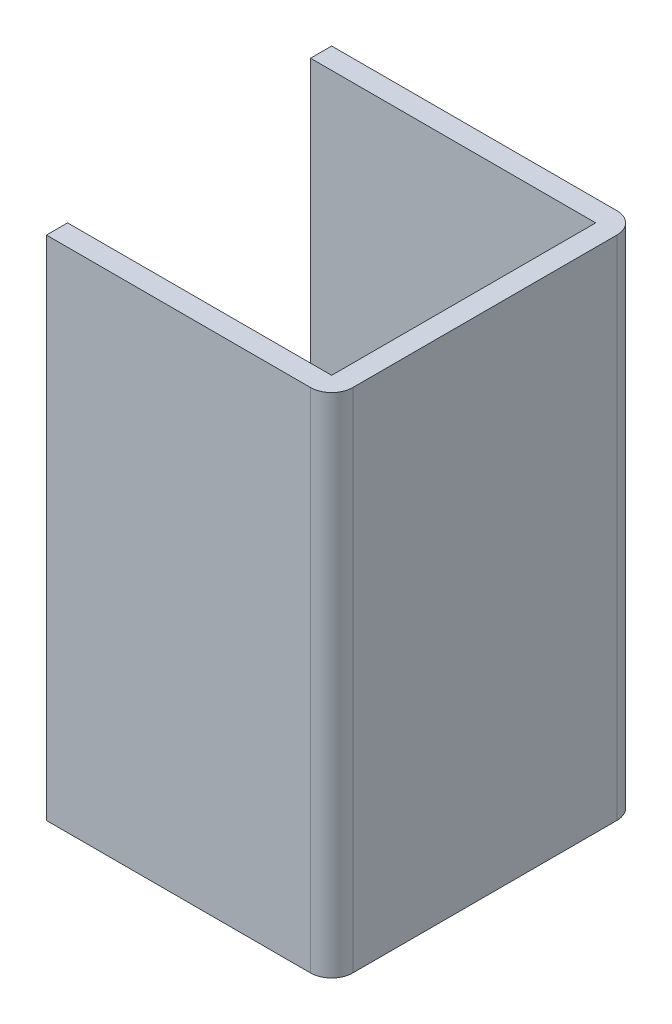
ISO-10303-21;
HEADER;
FILE_DESCRIPTION(('STEP AP214'),'2;1');
FILE_NAME('part.step','',(''),(''),'','','');
FILE_SCHEMA(('AUTOMOTIVE_DESIGN { 1 0 10303 214 1 1 1 1 }'));
ENDSEC;
DATA;
#1=APPLICATION_CONTEXT('core data for automotive mechanical design processes');
#2=APPLICATION_PROTOCOL_DEFINITION('international standard','automotive_design',2000,#1);
#3=PRODUCT_CONTEXT('',#1,'mechanical');
#4=PRODUCT('Part','Part','',(#3));
#5=PRODUCT_RELATED_PRODUCT_CATEGORY('part','',(#4));
#6=PRODUCT_DEFINITION_FORMATION('','',#4);
#7=PRODUCT_DEFINITION_CONTEXT('part definition',#1,'design');
#8=PRODUCT_DEFINITION('design','',#6,#7);
#9=PRODUCT_DEFINITION_SHAPE('','',#8);
#10=(LENGTH_UNIT() NAMED_UNIT(*) SI_UNIT(.MILLI.,.METRE.));
#11=(NAMED_UNIT(*) PLANE_ANGLE_UNIT() SI_UNIT($,.RADIAN.));
#12=(NAMED_UNIT(*) SI_UNIT($,.STERADIAN.) SOLID_ANGLE_UNIT());
#13=UNCERTAINTY_MEASURE_WITH_UNIT(LENGTH_MEASURE(1.E-05),#10,'distance_accuracy_value','');
#14=(GEOMETRIC_REPRESENTATION_CONTEXT(3) GLOBAL_UNCERTAINTY_ASSIGNED_CONTEXT((#13)) GLOBAL_UNIT_ASSIGNED_CONTEXT((#10,
#11,#12)) REPRESENTATION_CONTEXT('',''));
#15=CARTESIAN_POINT('',(0.,0.,0.));
#16=DIRECTION('',(0.,0.,1.));
#17=DIRECTION('',(1.,0.,0.));
#18=AXIS2_PLACEMENT_3D('',#15,#16,#17);
#19=CARTESIAN_POINT('',(2.3,-1.2,1.35));
#20=DIRECTION('',(1.,0.,0.));
#21=DIRECTION('',(0.,0.,-1.));
#22=AXIS2_PLACEMENT_3D('',#19,#20,#21);
#23=PLANE('',#22);
#24=DIRECTION('',(0.,0.,-1.));
#25=VECTOR('',#24,1.);
#26=CARTESIAN_POINT('',(2.3,1.2,1.35));
#27=LINE('',#26,#25);
#28=CARTESIAN_POINT('',(2.3,1.2,1.35));
#29=VERTEX_POINT('',#28);
#30=CARTESIAN_POINT('',(2.3,1.2,1.45));
#31=VERTEX_POINT('',#30);
#32=EDGE_CURVE('E117',#29,#31,#27,.F.);
#33=ORIENTED_EDGE('',*,*,#32,.F.);
#34=DIRECTION('',(0.,1.,0.));
#35=VECTOR('',#34,1.);
#36=CARTESIAN_POINT('',(2.3,-1.2,1.35));
#37=LINE('',#36,#35);
#38=CARTESIAN_POINT('',(2.3,-1.2,1.35));
#39=VERTEX_POINT('',#38);
#40=EDGE_CURVE('E115',#29,#39,#37,.F.);
#41=ORIENTED_EDGE('',*,*,#40,.T.);
#42=DIRECTION('',(0.,0.,-1.));
#43=VECTOR('',#42,1.);
#44=CARTESIAN_POINT('',(2.3,-1.2,1.35));
#45=LINE('',#44,#43);
#46=CARTESIAN_POINT('',(2.3,-1.2,1.45));
#47=VERTEX_POINT('',#46);
#48=EDGE_CURVE('E96',#47,#39,#45,.T.);
#49=ORIENTED_EDGE('',*,*,#48,.F.);
#50=DIRECTION('',(0.,1.,0.));
#51=VECTOR('',#50,1.);
#52=CARTESIAN_POINT('',(2.3,0.,1.45));
#53=LINE('',#52,#51);
#54=EDGE_CURVE('E112',#31,#47,#53,.F.);
#55=ORIENTED_EDGE('',*,*,#54,.F.);
#56=EDGE_LOOP('',(#33,#41,#49,#55));
#57=FACE_BOUND('',#56,.T.);
#58=ADVANCED_FACE('F17',(#57),#23,.F.);
#59=CARTESIAN_POINT('',(2.3,-1.2,1.35));
#60=DIRECTION('',(0.,0.,1.));
#61=DIRECTION('',(1.,0.,0.));
#62=AXIS2_PLACEMENT_3D('',#59,#60,#61);
#63=PLANE('',#62);
#64=DIRECTION('',(0.,1.,0.));
#65=VECTOR('',#64,1.);
#66=CARTESIAN_POINT('',(3.55,-1.2,1.35));
#67=LINE('',#66,#65);
#68=CARTESIAN_POINT('',(3.55,1.2,1.35));
#69=VERTEX_POINT('',#68);
#70=CARTESIAN_POINT('',(3.55,-1.2,1.35));
#71=VERTEX_POINT('',#70);
#72=EDGE_CURVE('E153',#69,#71,#67,.F.);
#73=ORIENTED_EDGE('',*,*,#72,.T.);
#74=DIRECTION('',(1.,0.,0.));
#75=VECTOR('',#74,1.);
#76=CARTESIAN_POINT('',(2.3,-1.2,1.35));
#77=LINE('',#76,#75);
#78=EDGE_CURVE('E137',#39,#71,#77,.T.);
#79=ORIENTED_EDGE('',*,*,#78,.F.);
#80=ORIENTED_EDGE('',*,*,#40,.F.);
#81=DIRECTION('',(1.,0.,0.));
#82=VECTOR('',#81,1.);
#83=CARTESIAN_POINT('',(2.3,1.2,1.35));
#84=LINE('',#83,#82);
#85=EDGE_CURVE('E108',#69,#29,#84,.F.);
#86=ORIENTED_EDGE('',*,*,#85,.F.);
#87=EDGE_LOOP('',(#73,#79,#80,#86));
#88=FACE_BOUND('',#87,.T.);
#89=ADVANCED_FACE('F174',(#88),#63,.F.);
#90=CARTESIAN_POINT('',(2.975,0.,1.45));
#91=DIRECTION('',(0.,0.,1.));
#92=DIRECTION('',(1.,0.,0.));
#93=AXIS2_PLACEMENT_3D('',#90,#91,#92);
#94=PLANE('',#93);
#95=DIRECTION('',(1.,0.,0.));
#96=VECTOR('',#95,1.);
#97=CARTESIAN_POINT('',(2.975,1.2,1.45));
#98=LINE('',#97,#96);
#99=CARTESIAN_POINT('',(3.55,1.2,1.45));
#100=VERTEX_POINT('',#99);
#101=EDGE_CURVE('E107',#100,#31,#98,.F.);
#102=ORIENTED_EDGE('',*,*,#101,.T.);
#103=ORIENTED_EDGE('',*,*,#54,.T.);
#104=DIRECTION('',(1.,0.,0.));
#105=VECTOR('',#104,1.);
#106=CARTESIAN_POINT('',(2.975,-1.2,1.45));
#107=LINE('',#106,#105);
#108=CARTESIAN_POINT('',(3.55,-1.2,1.45));
#109=VERTEX_POINT('',#108);
#110=EDGE_CURVE('E99',#47,#109,#107,.T.);
#111=ORIENTED_EDGE('',*,*,#110,.T.);
#112=DIRECTION('',(0.,1.,0.));
#113=VECTOR('',#112,1.);
#114=CARTESIAN_POINT('',(3.55,-1.2,1.45));
#115=LINE('',#114,#113);
#116=EDGE_CURVE('E146',#100,#109,#115,.F.);
#117=ORIENTED_EDGE('',*,*,#116,.F.);
#118=EDGE_LOOP('',(#102,#103,#111,#117));
#119=FACE_BOUND('',#118,.T.);
#120=ADVANCED_FACE('F119',(#119),#94,.T.);
#121=CARTESIAN_POINT('',(3.55,-1.2,0.));
#122=DIRECTION('',(1.,0.,0.));
#123=DIRECTION('',(0.,0.,-1.));
#124=AXIS2_PLACEMENT_3D('',#121,#122,#123);
#125=PLANE('',#124);
#126=DIRECTION('',(0.,0.,-1.));
#127=VECTOR('',#126,1.);
#128=CARTESIAN_POINT('',(3.55,1.2,0.));
#129=LINE('',#128,#127);
#130=CARTESIAN_POINT('',(3.55,1.2,0.1));
#131=VERTEX_POINT('',#130);
#132=EDGE_CURVE('E122',#131,#69,#129,.F.);
#133=ORIENTED_EDGE('',*,*,#132,.F.);
#134=DIRECTION('',(0.,1.,0.));
#135=VECTOR('',#134,1.);
#136=CARTESIAN_POINT('',(3.55,-1.2,0.1));
#137=LINE('',#136,#135);
#138=CARTESIAN_POINT('',(3.55,-1.2,0.1));
#139=VERTEX_POINT('',#138);
#140=EDGE_CURVE('E145',#139,#131,#137,.T.);
#141=ORIENTED_EDGE('',*,*,#140,.F.);
#142=DIRECTION('',(0.,0.,-1.));
#143=VECTOR('',#142,1.);
#144=CARTESIAN_POINT('',(3.55,-1.2,0.));
#145=LINE('',#144,#143);
#146=EDGE_CURVE('E120',#71,#139,#145,.T.);
#147=ORIENTED_EDGE('',*,*,#146,.F.);
#148=ORIENTED_EDGE('',*,*,#72,.F.);
#149=EDGE_LOOP('',(#133,#141,#147,#148));
#150=FACE_BOUND('',#149,.T.);
#151=ADVANCED_FACE('F176',(#150),#125,.F.);
#152=CARTESIAN_POINT('',(3.55,-1.2,1.35));
#153=DIRECTION('',(0.,1.,0.));
#154=DIRECTION('',(0.,0.,1.));
#155=AXIS2_PLACEMENT_3D('',#152,#153,#154);
#156=CYLINDRICAL_SURFACE('',#155,0.1);
#157=ORIENTED_EDGE('',*,*,#116,.T.);
#158=CARTESIAN_POINT('',(3.55,-1.2,1.35));
#159=DIRECTION('',(0.,1.,0.));
#160=DIRECTION('',(0.,0.,1.));
#161=AXIS2_PLACEMENT_3D('',#158,#159,#160);
#162=CIRCLE('',#161,0.1);
#163=CARTESIAN_POINT('',(3.65,-1.2,1.35));
#164=VERTEX_POINT('',#163);
#165=EDGE_CURVE('E102',#109,#164,#162,.T.);
#166=ORIENTED_EDGE('',*,*,#165,.T.);
#167=DIRECTION('',(0.,1.,0.));
#168=VECTOR('',#167,1.);
#169=CARTESIAN_POINT('',(3.65,-1.2,1.35));
#170=LINE('',#169,#168);
#171=CARTESIAN_POINT('',(3.65,1.2,1.35));
#172=VERTEX_POINT('',#171);
#173=EDGE_CURVE('E187',#172,#164,#170,.F.);
#174=ORIENTED_EDGE('',*,*,#173,.F.);
#175=CARTESIAN_POINT('',(3.55,1.2,1.35));
#176=DIRECTION('',(0.,1.,0.));
#177=DIRECTION('',(0.,0.,1.));
#178=AXIS2_PLACEMENT_3D('',#175,#176,#177);
#179=CIRCLE('',#178,0.1);
#180=EDGE_CURVE('E20',#172,#100,#179,.F.);
#181=ORIENTED_EDGE('',*,*,#180,.T.);
#182=EDGE_LOOP('',(#157,#166,#174,#181));
#183=FACE_BOUND('',#182,.T.);
#184=ADVANCED_FACE('F292',(#183),#156,.T.);
#185=CARTESIAN_POINT('',(2.2,-1.2,0.1));
#186=DIRECTION('',(0.,0.,1.));
#187=DIRECTION('',(1.,0.,0.));
#188=AXIS2_PLACEMENT_3D('',#185,#186,#187);
#189=PLANE('',#188);
#190=ORIENTED_EDGE('',*,*,#140,.T.);
#191=DIRECTION('',(1.,0.,0.));
#192=VECTOR('',#191,1.);
#193=CARTESIAN_POINT('',(2.2,1.2,0.1));
#194=LINE('',#193,#192);
#195=CARTESIAN_POINT('',(2.2,1.2,0.1));
#196=VERTEX_POINT('',#195);
#197=EDGE_CURVE('E150',#131,#196,#194,.F.);
#198=ORIENTED_EDGE('',*,*,#197,.T.);
#199=DIRECTION('',(0.,1.,0.));
#200=VECTOR('',#199,1.);
#201=CARTESIAN_POINT('',(2.2,-1.2,0.1));
#202=LINE('',#201,#200);
#203=CARTESIAN_POINT('',(2.2,-1.2,0.1));
#204=VERTEX_POINT('',#203);
#205=EDGE_CURVE('E181',#196,#204,#202,.F.);
#206=ORIENTED_EDGE('',*,*,#205,.T.);
#207=DIRECTION('',(1.,0.,0.));
#208=VECTOR('',#207,1.);
#209=CARTESIAN_POINT('',(3.129518072289,-1.2,0.1));
#210=LINE('',#209,#208);
#211=EDGE_CURVE('E74',#139,#204,#210,.F.);
#212=ORIENTED_EDGE('',*,*,#211,.F.);
#213=EDGE_LOOP('',(#190,#198,#206,#212));
#214=FACE_BOUND('',#213,.T.);
#215=ADVANCED_FACE('F179',(#214),#189,.T.);
#216=CARTESIAN_POINT('',(3.65,-1.2,0.));
#217=DIRECTION('',(1.,0.,0.));
#218=DIRECTION('',(0.,0.,-1.));
#219=AXIS2_PLACEMENT_3D('',#216,#217,#218);
#220=PLANE('',#219);
#221=DIRECTION('',(0.,0.,1.));
#222=VECTOR('',#221,1.);
#223=CARTESIAN_POINT('',(3.65,1.2,0.708734939759));
#224=LINE('',#223,#222);
#225=CARTESIAN_POINT('',(3.65,1.2,0.1));
#226=VERTEX_POINT('',#225);
#227=EDGE_CURVE('E205',#172,#226,#224,.F.);
#228=ORIENTED_EDGE('',*,*,#227,.F.);
#229=ORIENTED_EDGE('',*,*,#173,.T.);
#230=DIRECTION('',(0.,0.,1.));
#231=VECTOR('',#230,1.);
#232=CARTESIAN_POINT('',(3.65,-1.2,0.708734939759));
#233=LINE('',#232,#231);
#234=CARTESIAN_POINT('',(3.65,-1.2,0.1));
#235=VERTEX_POINT('',#234);
#236=EDGE_CURVE('E184',#235,#164,#233,.T.);
#237=ORIENTED_EDGE('',*,*,#236,.F.);
#238=DIRECTION('',(0.,1.,0.));
#239=VECTOR('',#238,1.);
#240=CARTESIAN_POINT('',(3.65,-1.2,0.1));
#241=LINE('',#240,#239);
#242=EDGE_CURVE('E141',#226,#235,#241,.F.);
#243=ORIENTED_EDGE('',*,*,#242,.F.);
#244=EDGE_LOOP('',(#228,#229,#237,#243));
#245=FACE_BOUND('',#244,.T.);
#246=ADVANCED_FACE('F230',(#245),#220,.T.);
#247=CARTESIAN_POINT('',(3.129518072289,-1.2,0.708734939759));
#248=DIRECTION('',(0.,-1.,0.));
#249=DIRECTION('',(1.,0.,0.));
#250=AXIS2_PLACEMENT_3D('',#247,#248,#249);
#251=PLANE('',#250);
#252=ORIENTED_EDGE('',*,*,#211,.T.);
#253=DIRECTION('',(0.,0.,-1.));
#254=VECTOR('',#253,1.);
#255=CARTESIAN_POINT('',(2.2,-1.2,0.));
#256=LINE('',#255,#254);
#257=CARTESIAN_POINT('',(2.2,-1.2,0.));
#258=VERTEX_POINT('',#257);
#259=EDGE_CURVE('E183',#204,#258,#256,.T.);
#260=ORIENTED_EDGE('',*,*,#259,.T.);
#261=DIRECTION('',(-1.,0.,0.));
#262=VECTOR('',#261,1.);
#263=CARTESIAN_POINT('',(2.925,-1.2,0.));
#264=LINE('',#263,#262);
#265=CARTESIAN_POINT('',(3.55,-1.2,0.));
#266=VERTEX_POINT('',#265);
#267=EDGE_CURVE('E207',#266,#258,#264,.T.);
#268=ORIENTED_EDGE('',*,*,#267,.F.);
#269=CARTESIAN_POINT('',(3.55,-1.2,0.1));
#270=DIRECTION('',(0.,1.,0.));
#271=DIRECTION('',(0.,0.,1.));
#272=AXIS2_PLACEMENT_3D('',#269,#270,#271);
#273=CIRCLE('',#272,0.1);
#274=EDGE_CURVE('E142',#235,#266,#273,.T.);
#275=ORIENTED_EDGE('',*,*,#274,.F.);
#276=ORIENTED_EDGE('',*,*,#236,.T.);
#277=ORIENTED_EDGE('',*,*,#165,.F.);
#278=ORIENTED_EDGE('',*,*,#110,.F.);
#279=ORIENTED_EDGE('',*,*,#48,.T.);
#280=ORIENTED_EDGE('',*,*,#78,.T.);
#281=ORIENTED_EDGE('',*,*,#146,.T.);
#282=EDGE_LOOP('',(#252,#260,#268,#275,#276,#277,#278,#279,#280,#281));
#283=FACE_BOUND('',#282,.T.);
#284=ADVANCED_FACE('F100',(#283),#251,.T.);
#285=CARTESIAN_POINT('',(2.2,-1.2,0.));
#286=DIRECTION('',(1.,0.,0.));
#287=DIRECTION('',(0.,0.,-1.));
#288=AXIS2_PLACEMENT_3D('',#285,#286,#287);
#289=PLANE('',#288);
#290=DIRECTION('',(0.,0.,1.));
#291=VECTOR('',#290,1.);
#292=CARTESIAN_POINT('',(2.2,1.2,0.708734939759));
#293=LINE('',#292,#291);
#294=CARTESIAN_POINT('',(2.2,1.2,0.));
#295=VERTEX_POINT('',#294);
#296=EDGE_CURVE('E144',#295,#196,#293,.T.);
#297=ORIENTED_EDGE('',*,*,#296,.F.);
#298=DIRECTION('',(0.,1.,0.));
#299=VECTOR('',#298,1.);
#300=CARTESIAN_POINT('',(2.2,0.,0.));
#301=LINE('',#300,#299);
#302=EDGE_CURVE('E213',#258,#295,#301,.T.);
#303=ORIENTED_EDGE('',*,*,#302,.F.);
#304=ORIENTED_EDGE('',*,*,#259,.F.);
#305=ORIENTED_EDGE('',*,*,#205,.F.);
#306=EDGE_LOOP('',(#297,#303,#304,#305));
#307=FACE_BOUND('',#306,.T.);
#308=ADVANCED_FACE('F238',(#307),#289,.F.);
#309=CARTESIAN_POINT('',(3.129518072289,1.2,0.708734939759));
#310=DIRECTION('',(0.,1.,0.));
#311=DIRECTION('',(-1.,0.,0.));
#312=AXIS2_PLACEMENT_3D('',#309,#310,#311);
#313=PLANE('',#312);
#314=ORIENTED_EDGE('',*,*,#85,.T.);
#315=ORIENTED_EDGE('',*,*,#32,.T.);
#316=ORIENTED_EDGE('',*,*,#101,.F.);
#317=ORIENTED_EDGE('',*,*,#180,.F.);
#318=ORIENTED_EDGE('',*,*,#227,.T.);
#319=CARTESIAN_POINT('',(3.55,1.2,0.1));
#320=DIRECTION('',(0.,1.,0.));
#321=DIRECTION('',(0.,0.,1.));
#322=AXIS2_PLACEMENT_3D('',#319,#320,#321);
#323=CIRCLE('',#322,0.1);
#324=CARTESIAN_POINT('',(3.55,1.2,0.));
#325=VERTEX_POINT('',#324);
#326=EDGE_CURVE('E35',#325,#226,#323,.F.);
#327=ORIENTED_EDGE('',*,*,#326,.F.);
#328=DIRECTION('',(-1.,0.,0.));
#329=VECTOR('',#328,1.);
#330=CARTESIAN_POINT('',(2.925,1.2,0.));
#331=LINE('',#330,#329);
#332=EDGE_CURVE('E26',#295,#325,#331,.F.);
#333=ORIENTED_EDGE('',*,*,#332,.F.);
#334=ORIENTED_EDGE('',*,*,#296,.T.);
#335=ORIENTED_EDGE('',*,*,#197,.F.);
#336=ORIENTED_EDGE('',*,*,#132,.T.);
#337=EDGE_LOOP('',(#314,#315,#316,#317,#318,#327,#333,#334,#335,#336));
#338=FACE_BOUND('',#337,.T.);
#339=ADVANCED_FACE('F198',(#338),#313,.T.);
#340=CARTESIAN_POINT('',(3.55,-1.2,0.1));
#341=DIRECTION('',(0.,1.,0.));
#342=DIRECTION('',(0.,0.,1.));
#343=AXIS2_PLACEMENT_3D('',#340,#341,#342);
#344=CYLINDRICAL_SURFACE('',#343,0.1);
#345=ORIENTED_EDGE('',*,*,#326,.T.);
#346=ORIENTED_EDGE('',*,*,#242,.T.);
#347=ORIENTED_EDGE('',*,*,#274,.T.);
#348=DIRECTION('',(0.,1.,0.));
#349=VECTOR('',#348,1.);
#350=CARTESIAN_POINT('',(3.55,0.,0.));
#351=LINE('',#350,#349);
#352=EDGE_CURVE('E11',#325,#266,#351,.F.);
#353=ORIENTED_EDGE('',*,*,#352,.F.);
#354=EDGE_LOOP('',(#345,#346,#347,#353));
#355=FACE_BOUND('',#354,.T.);
#356=ADVANCED_FACE('F233',(#355),#344,.T.);
#357=CARTESIAN_POINT('',(2.925,0.,0.));
#358=DIRECTION('',(0.,0.,-1.));
#359=DIRECTION('',(-1.,0.,0.));
#360=AXIS2_PLACEMENT_3D('',#357,#358,#359);
#361=PLANE('',#360);
#362=ORIENTED_EDGE('',*,*,#332,.T.);
#363=ORIENTED_EDGE('',*,*,#352,.T.);
#364=ORIENTED_EDGE('',*,*,#267,.T.);
#365=ORIENTED_EDGE('',*,*,#302,.T.);
#366=EDGE_LOOP('',(#362,#363,#364,#365));
#367=FACE_BOUND('',#366,.T.);
#368=ADVANCED_FACE('F235',(#367),#361,.T.);
#369=CLOSED_SHELL('',(#58,#89,#120,#151,#184,#215,#246,#284,#308,#339,#356,#368));
#370=MANIFOLD_SOLID_BREP('B1',#369);
#371=ADVANCED_BREP_SHAPE_REPRESENTATION('',(#18,#370),#14);
#372=SHAPE_DEFINITION_REPRESENTATION(#9,#371);
ENDSEC;
END-ISO-10303-21;
